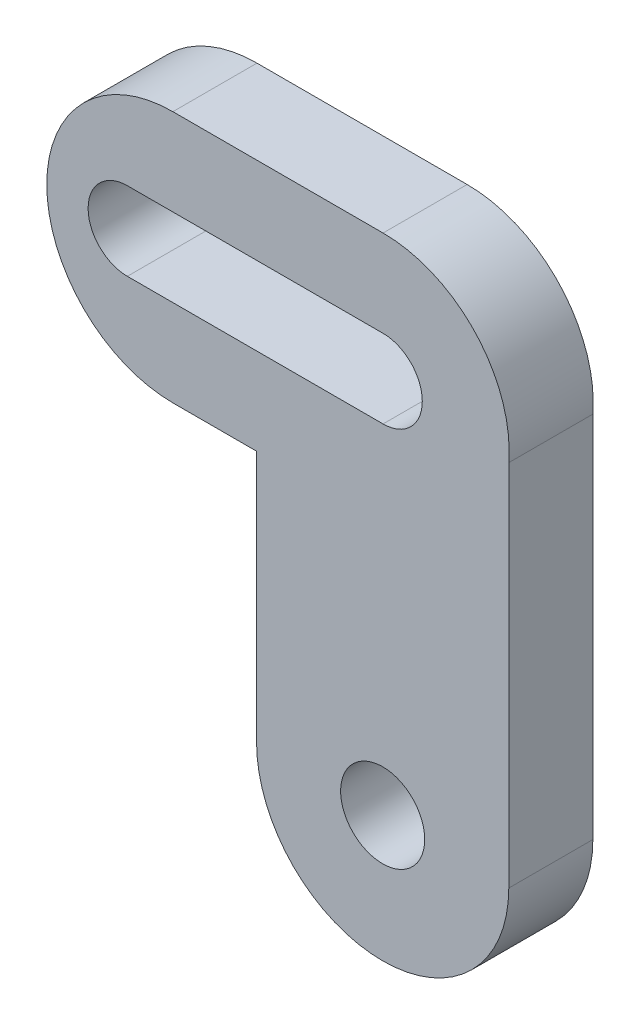
ISO-10303-21;
HEADER;
FILE_DESCRIPTION(('STEP AP214'),'2;1');
FILE_NAME('part.step','',(''),(''),'','','');
FILE_SCHEMA(('AUTOMOTIVE_DESIGN { 1 0 10303 214 1 1 1 1 }'));
ENDSEC;
DATA;
#1=APPLICATION_CONTEXT('core data for automotive mechanical design processes');
#2=APPLICATION_PROTOCOL_DEFINITION('international standard','automotive_design',2000,#1);
#3=PRODUCT_CONTEXT('',#1,'mechanical');
#4=PRODUCT('Part','Part','',(#3));
#5=PRODUCT_RELATED_PRODUCT_CATEGORY('part','',(#4));
#6=PRODUCT_DEFINITION_FORMATION('','',#4);
#7=PRODUCT_DEFINITION_CONTEXT('part definition',#1,'design');
#8=PRODUCT_DEFINITION('design','',#6,#7);
#9=PRODUCT_DEFINITION_SHAPE('','',#8);
#10=(LENGTH_UNIT() NAMED_UNIT(*) SI_UNIT(.MILLI.,.METRE.));
#11=(NAMED_UNIT(*) PLANE_ANGLE_UNIT() SI_UNIT($,.RADIAN.));
#12=(NAMED_UNIT(*) SI_UNIT($,.STERADIAN.) SOLID_ANGLE_UNIT());
#13=UNCERTAINTY_MEASURE_WITH_UNIT(LENGTH_MEASURE(1.E-05),#10,'distance_accuracy_value','');
#14=(GEOMETRIC_REPRESENTATION_CONTEXT(3) GLOBAL_UNCERTAINTY_ASSIGNED_CONTEXT((#13)) GLOBAL_UNIT_ASSIGNED_CONTEXT((#10,
#11,#12)) REPRESENTATION_CONTEXT('',''));
#15=CARTESIAN_POINT('',(0.,0.,0.));
#16=DIRECTION('',(0.,0.,1.));
#17=DIRECTION('',(1.,0.,0.));
#18=AXIS2_PLACEMENT_3D('',#15,#16,#17);
#19=CARTESIAN_POINT('',(180.8549532214,220.7512286528,3.));
#20=DIRECTION('',(0.,0.,-1.));
#21=DIRECTION('',(-1.,0.,0.));
#22=AXIS2_PLACEMENT_3D('',#19,#20,#21);
#23=CYLINDRICAL_SURFACE('',#22,1.40000000000001);
#24=CARTESIAN_POINT('',(180.8549532214,220.7512286528,0.));
#25=DIRECTION('',(0.,0.,1.));
#26=DIRECTION('',(1.,0.,0.));
#27=AXIS2_PLACEMENT_3D('',#24,#25,#26);
#28=CIRCLE('',#27,1.40000000000001);
#29=CARTESIAN_POINT('',(180.8549532214,219.3512286528,0.));
#30=VERTEX_POINT('',#29);
#31=CARTESIAN_POINT('',(180.8549532214,222.1512286528,0.));
#32=VERTEX_POINT('',#31);
#33=EDGE_CURVE('E172',#30,#32,#28,.T.);
#34=ORIENTED_EDGE('',*,*,#33,.F.);
#35=DIRECTION('',(0.,0.,-1.));
#36=VECTOR('',#35,1.);
#37=CARTESIAN_POINT('',(180.8549532214,219.3512286528,3.));
#38=LINE('',#37,#36);
#39=CARTESIAN_POINT('',(180.8549532214,219.3512286528,3.));
#40=VERTEX_POINT('',#39);
#41=EDGE_CURVE('E11',#40,#30,#38,.T.);
#42=ORIENTED_EDGE('',*,*,#41,.F.);
#43=CARTESIAN_POINT('',(180.8549532214,220.7512286528,3.));
#44=DIRECTION('',(0.,0.,1.));
#45=DIRECTION('',(1.,0.,0.));
#46=AXIS2_PLACEMENT_3D('',#43,#44,#45);
#47=CIRCLE('',#46,1.40000000000001);
#48=CARTESIAN_POINT('',(180.8549532214,222.1512286528,3.));
#49=VERTEX_POINT('',#48);
#50=EDGE_CURVE('E140',#40,#49,#47,.T.);
#51=ORIENTED_EDGE('',*,*,#50,.T.);
#52=DIRECTION('',(0.,0.,-1.));
#53=VECTOR('',#52,1.);
#54=CARTESIAN_POINT('',(180.8549532214,222.1512286528,3.));
#55=LINE('',#54,#53);
#56=EDGE_CURVE('E95',#49,#32,#55,.T.);
#57=ORIENTED_EDGE('',*,*,#56,.T.);
#58=EDGE_LOOP('',(#34,#42,#51,#57));
#59=FACE_BOUND('',#58,.T.);
#60=ADVANCED_FACE('F33',(#59),#23,.F.);
#61=CARTESIAN_POINT('',(0.,219.3512286528,3.));
#62=DIRECTION('',(0.,1.,0.));
#63=DIRECTION('',(0.,0.,1.));
#64=AXIS2_PLACEMENT_3D('',#61,#62,#63);
#65=PLANE('',#64);
#66=DIRECTION('',(1.,0.,0.));
#67=VECTOR('',#66,1.);
#68=CARTESIAN_POINT('',(0.,219.3512286528,0.));
#69=LINE('',#68,#67);
#70=CARTESIAN_POINT('',(171.7299532214,219.3512286528,0.));
#71=VERTEX_POINT('',#70);
#72=EDGE_CURVE('E131',#71,#30,#69,.T.);
#73=ORIENTED_EDGE('',*,*,#72,.F.);
#74=DIRECTION('',(0.,0.,-1.));
#75=VECTOR('',#74,1.);
#76=CARTESIAN_POINT('',(171.7299532214,219.3512286528,3.));
#77=LINE('',#76,#75);
#78=CARTESIAN_POINT('',(171.7299532214,219.3512286528,3.));
#79=VERTEX_POINT('',#78);
#80=EDGE_CURVE('E43',#79,#71,#77,.T.);
#81=ORIENTED_EDGE('',*,*,#80,.F.);
#82=DIRECTION('',(1.,0.,0.));
#83=VECTOR('',#82,1.);
#84=CARTESIAN_POINT('',(0.,219.3512286528,3.));
#85=LINE('',#84,#83);
#86=EDGE_CURVE('E129',#79,#40,#85,.T.);
#87=ORIENTED_EDGE('',*,*,#86,.T.);
#88=ORIENTED_EDGE('',*,*,#41,.T.);
#89=EDGE_LOOP('',(#73,#81,#87,#88));
#90=FACE_BOUND('',#89,.T.);
#91=ADVANCED_FACE('F128',(#90),#65,.T.);
#92=CARTESIAN_POINT('',(171.7299532214,220.7512286528,3.));
#93=DIRECTION('',(0.,0.,-1.));
#94=DIRECTION('',(-1.,0.,0.));
#95=AXIS2_PLACEMENT_3D('',#92,#93,#94);
#96=CYLINDRICAL_SURFACE('',#95,1.40000000000001);
#97=CARTESIAN_POINT('',(171.7299532214,220.7512286528,0.));
#98=DIRECTION('',(0.,0.,1.));
#99=DIRECTION('',(1.,0.,0.));
#100=AXIS2_PLACEMENT_3D('',#97,#98,#99);
#101=CIRCLE('',#100,1.40000000000001);
#102=CARTESIAN_POINT('',(171.7299532214,222.1512286528,0.));
#103=VERTEX_POINT('',#102);
#104=EDGE_CURVE('E176',#103,#71,#101,.T.);
#105=ORIENTED_EDGE('',*,*,#104,.F.);
#106=DIRECTION('',(0.,0.,-1.));
#107=VECTOR('',#106,1.);
#108=CARTESIAN_POINT('',(171.7299532214,222.1512286528,3.));
#109=LINE('',#108,#107);
#110=CARTESIAN_POINT('',(171.7299532214,222.1512286528,3.));
#111=VERTEX_POINT('',#110);
#112=EDGE_CURVE('E88',#111,#103,#109,.T.);
#113=ORIENTED_EDGE('',*,*,#112,.F.);
#114=CARTESIAN_POINT('',(171.7299532214,220.7512286528,3.));
#115=DIRECTION('',(0.,0.,1.));
#116=DIRECTION('',(1.,0.,0.));
#117=AXIS2_PLACEMENT_3D('',#114,#115,#116);
#118=CIRCLE('',#117,1.40000000000001);
#119=EDGE_CURVE('E139',#111,#79,#118,.T.);
#120=ORIENTED_EDGE('',*,*,#119,.T.);
#121=ORIENTED_EDGE('',*,*,#80,.T.);
#122=EDGE_LOOP('',(#105,#113,#120,#121));
#123=FACE_BOUND('',#122,.T.);
#124=ADVANCED_FACE('F142',(#123),#96,.F.);
#125=CARTESIAN_POINT('',(185.3409928876,0.,3.));
#126=DIRECTION('',(1.,0.,0.));
#127=DIRECTION('',(0.,0.,-1.));
#128=AXIS2_PLACEMENT_3D('',#125,#126,#127);
#129=PLANE('',#128);
#130=DIRECTION('',(0.,-1.,0.));
#131=VECTOR('',#130,1.);
#132=CARTESIAN_POINT('',(185.3409928876,0.,0.));
#133=LINE('',#132,#131);
#134=CARTESIAN_POINT('',(185.3409928876,220.397042101277,0.));
#135=VERTEX_POINT('',#134);
#136=CARTESIAN_POINT('',(185.3409928876,207.2512286528,0.));
#137=VERTEX_POINT('',#136);
#138=EDGE_CURVE('E151',#135,#137,#133,.T.);
#139=ORIENTED_EDGE('',*,*,#138,.F.);
#140=DIRECTION('',(0.,0.,-1.));
#141=VECTOR('',#140,1.);
#142=CARTESIAN_POINT('',(185.3409928876,220.397042101277,3.));
#143=LINE('',#142,#141);
#144=CARTESIAN_POINT('',(185.3409928876,220.397042101277,3.));
#145=VERTEX_POINT('',#144);
#146=EDGE_CURVE('E37',#145,#135,#143,.T.);
#147=ORIENTED_EDGE('',*,*,#146,.F.);
#148=DIRECTION('',(0.,-1.,0.));
#149=VECTOR('',#148,1.);
#150=CARTESIAN_POINT('',(185.3409928876,0.,3.));
#151=LINE('',#150,#149);
#152=CARTESIAN_POINT('',(185.3409928876,207.2512286528,3.));
#153=VERTEX_POINT('',#152);
#154=EDGE_CURVE('E183',#145,#153,#151,.T.);
#155=ORIENTED_EDGE('',*,*,#154,.T.);
#156=DIRECTION('',(0.,0.,-1.));
#157=VECTOR('',#156,1.);
#158=CARTESIAN_POINT('',(185.3409928876,207.2512286528,3.));
#159=LINE('',#158,#157);
#160=EDGE_CURVE('E150',#153,#137,#159,.T.);
#161=ORIENTED_EDGE('',*,*,#160,.T.);
#162=EDGE_LOOP('',(#139,#147,#155,#161));
#163=FACE_BOUND('',#162,.T.);
#164=ADVANCED_FACE('F35',(#163),#129,.T.);
#165=CARTESIAN_POINT('',(180.8549532214,220.7512286528,3.));
#166=DIRECTION('',(0.,0.,-1.));
#167=DIRECTION('',(-1.,0.,0.));
#168=AXIS2_PLACEMENT_3D('',#165,#166,#167);
#169=CYLINDRICAL_SURFACE('',#168,4.5);
#170=CARTESIAN_POINT('',(180.8549532214,220.7512286528,0.));
#171=DIRECTION('',(0.,0.,1.));
#172=DIRECTION('',(1.,0.,0.));
#173=AXIS2_PLACEMENT_3D('',#170,#171,#172);
#174=CIRCLE('',#173,4.5);
#175=CARTESIAN_POINT('',(180.8549532214,225.2512286528,0.));
#176=VERTEX_POINT('',#175);
#177=EDGE_CURVE('E154',#135,#176,#174,.T.);
#178=ORIENTED_EDGE('',*,*,#177,.T.);
#179=DIRECTION('',(0.,0.,-1.));
#180=VECTOR('',#179,1.);
#181=CARTESIAN_POINT('',(180.8549532214,225.2512286528,3.));
#182=LINE('',#181,#180);
#183=CARTESIAN_POINT('',(180.8549532214,225.2512286528,3.));
#184=VERTEX_POINT('',#183);
#185=EDGE_CURVE('E194',#184,#176,#182,.T.);
#186=ORIENTED_EDGE('',*,*,#185,.F.);
#187=CARTESIAN_POINT('',(180.8549532214,220.7512286528,3.));
#188=DIRECTION('',(0.,0.,1.));
#189=DIRECTION('',(1.,0.,0.));
#190=AXIS2_PLACEMENT_3D('',#187,#188,#189);
#191=CIRCLE('',#190,4.5);
#192=EDGE_CURVE('E202',#145,#184,#191,.T.);
#193=ORIENTED_EDGE('',*,*,#192,.F.);
#194=ORIENTED_EDGE('',*,*,#146,.T.);
#195=EDGE_LOOP('',(#178,#186,#193,#194));
#196=FACE_BOUND('',#195,.T.);
#197=ADVANCED_FACE('F201',(#196),#169,.T.);
#198=CARTESIAN_POINT('',(0.,225.2512286528,3.));
#199=DIRECTION('',(0.,1.,0.));
#200=DIRECTION('',(0.,0.,1.));
#201=AXIS2_PLACEMENT_3D('',#198,#199,#200);
#202=PLANE('',#201);
#203=DIRECTION('',(1.,0.,0.));
#204=VECTOR('',#203,1.);
#205=CARTESIAN_POINT('',(0.,225.2512286528,0.));
#206=LINE('',#205,#204);
#207=CARTESIAN_POINT('',(173.3549532214,225.2512286528,0.));
#208=VERTEX_POINT('',#207);
#209=EDGE_CURVE('E157',#208,#176,#206,.T.);
#210=ORIENTED_EDGE('',*,*,#209,.F.);
#211=DIRECTION('',(0.,0.,-1.));
#212=VECTOR('',#211,1.);
#213=CARTESIAN_POINT('',(173.3549532214,225.2512286528,3.));
#214=LINE('',#213,#212);
#215=CARTESIAN_POINT('',(173.3549532214,225.2512286528,3.));
#216=VERTEX_POINT('',#215);
#217=EDGE_CURVE('E193',#216,#208,#214,.T.);
#218=ORIENTED_EDGE('',*,*,#217,.F.);
#219=DIRECTION('',(1.,0.,0.));
#220=VECTOR('',#219,1.);
#221=CARTESIAN_POINT('',(0.,225.2512286528,3.));
#222=LINE('',#221,#220);
#223=EDGE_CURVE('E229',#216,#184,#222,.T.);
#224=ORIENTED_EDGE('',*,*,#223,.T.);
#225=ORIENTED_EDGE('',*,*,#185,.T.);
#226=EDGE_LOOP('',(#210,#218,#224,#225));
#227=FACE_BOUND('',#226,.T.);
#228=ADVANCED_FACE('F226',(#227),#202,.T.);
#229=CARTESIAN_POINT('',(173.3549532214,220.7512286528,3.));
#230=DIRECTION('',(0.,0.,-1.));
#231=DIRECTION('',(-1.,0.,0.));
#232=AXIS2_PLACEMENT_3D('',#229,#230,#231);
#233=CYLINDRICAL_SURFACE('',#232,4.5);
#234=CARTESIAN_POINT('',(173.3549532214,220.7512286528,0.));
#235=DIRECTION('',(0.,0.,1.));
#236=DIRECTION('',(1.,0.,0.));
#237=AXIS2_PLACEMENT_3D('',#234,#235,#236);
#238=CIRCLE('',#237,4.5);
#239=CARTESIAN_POINT('',(173.3549532214,216.2512286528,0.));
#240=VERTEX_POINT('',#239);
#241=EDGE_CURVE('E160',#208,#240,#238,.T.);
#242=ORIENTED_EDGE('',*,*,#241,.T.);
#243=DIRECTION('',(0.,0.,-1.));
#244=VECTOR('',#243,1.);
#245=CARTESIAN_POINT('',(173.3549532214,216.2512286528,3.));
#246=LINE('',#245,#244);
#247=CARTESIAN_POINT('',(173.3549532214,216.2512286528,3.));
#248=VERTEX_POINT('',#247);
#249=EDGE_CURVE('E191',#248,#240,#246,.T.);
#250=ORIENTED_EDGE('',*,*,#249,.F.);
#251=CARTESIAN_POINT('',(173.3549532214,220.7512286528,3.));
#252=DIRECTION('',(0.,0.,1.));
#253=DIRECTION('',(1.,0.,0.));
#254=AXIS2_PLACEMENT_3D('',#251,#252,#253);
#255=CIRCLE('',#254,4.5);
#256=EDGE_CURVE('E230',#216,#248,#255,.T.);
#257=ORIENTED_EDGE('',*,*,#256,.F.);
#258=ORIENTED_EDGE('',*,*,#217,.T.);
#259=EDGE_LOOP('',(#242,#250,#257,#258));
#260=FACE_BOUND('',#259,.T.);
#261=ADVANCED_FACE('F231',(#260),#233,.T.);
#262=CARTESIAN_POINT('',(0.,216.2512286528,3.));
#263=DIRECTION('',(0.,-1.,0.));
#264=DIRECTION('',(0.,0.,-1.));
#265=AXIS2_PLACEMENT_3D('',#262,#263,#264);
#266=PLANE('',#265);
#267=DIRECTION('',(-1.,0.,0.));
#268=VECTOR('',#267,1.);
#269=CARTESIAN_POINT('',(0.,216.2512286528,0.));
#270=LINE('',#269,#268);
#271=CARTESIAN_POINT('',(176.3409928876,216.2512286528,0.));
#272=VERTEX_POINT('',#271);
#273=EDGE_CURVE('E163',#272,#240,#270,.T.);
#274=ORIENTED_EDGE('',*,*,#273,.F.);
#275=DIRECTION('',(0.,0.,-1.));
#276=VECTOR('',#275,1.);
#277=CARTESIAN_POINT('',(176.3409928876,216.2512286528,3.));
#278=LINE('',#277,#276);
#279=CARTESIAN_POINT('',(176.3409928876,216.2512286528,3.));
#280=VERTEX_POINT('',#279);
#281=EDGE_CURVE('E189',#280,#272,#278,.T.);
#282=ORIENTED_EDGE('',*,*,#281,.F.);
#283=DIRECTION('',(-1.,0.,0.));
#284=VECTOR('',#283,1.);
#285=CARTESIAN_POINT('',(0.,216.2512286528,3.));
#286=LINE('',#285,#284);
#287=EDGE_CURVE('E233',#280,#248,#286,.T.);
#288=ORIENTED_EDGE('',*,*,#287,.T.);
#289=ORIENTED_EDGE('',*,*,#249,.T.);
#290=EDGE_LOOP('',(#274,#282,#288,#289));
#291=FACE_BOUND('',#290,.T.);
#292=ADVANCED_FACE('F223',(#291),#266,.T.);
#293=CARTESIAN_POINT('',(176.3409928876,0.,3.));
#294=DIRECTION('',(-1.,0.,0.));
#295=DIRECTION('',(0.,0.,1.));
#296=AXIS2_PLACEMENT_3D('',#293,#294,#295);
#297=PLANE('',#296);
#298=DIRECTION('',(0.,1.,0.));
#299=VECTOR('',#298,1.);
#300=CARTESIAN_POINT('',(176.3409928876,0.,0.));
#301=LINE('',#300,#299);
#302=CARTESIAN_POINT('',(176.3409928876,207.2512286528,0.));
#303=VERTEX_POINT('',#302);
#304=EDGE_CURVE('E166',#303,#272,#301,.T.);
#305=ORIENTED_EDGE('',*,*,#304,.F.);
#306=DIRECTION('',(0.,0.,-1.));
#307=VECTOR('',#306,1.);
#308=CARTESIAN_POINT('',(176.3409928876,207.2512286528,3.));
#309=LINE('',#308,#307);
#310=CARTESIAN_POINT('',(176.3409928876,207.2512286528,3.));
#311=VERTEX_POINT('',#310);
#312=EDGE_CURVE('E187',#311,#303,#309,.T.);
#313=ORIENTED_EDGE('',*,*,#312,.F.);
#314=DIRECTION('',(0.,1.,0.));
#315=VECTOR('',#314,1.);
#316=CARTESIAN_POINT('',(176.3409928876,0.,3.));
#317=LINE('',#316,#315);
#318=EDGE_CURVE('E219',#311,#280,#317,.T.);
#319=ORIENTED_EDGE('',*,*,#318,.T.);
#320=ORIENTED_EDGE('',*,*,#281,.T.);
#321=EDGE_LOOP('',(#305,#313,#319,#320));
#322=FACE_BOUND('',#321,.T.);
#323=ADVANCED_FACE('F215',(#322),#297,.T.);
#324=CARTESIAN_POINT('',(0.,222.1512286528,3.));
#325=DIRECTION('',(0.,1.,0.));
#326=DIRECTION('',(0.,0.,1.));
#327=AXIS2_PLACEMENT_3D('',#324,#325,#326);
#328=PLANE('',#327);
#329=DIRECTION('',(1.,0.,0.));
#330=VECTOR('',#329,1.);
#331=CARTESIAN_POINT('',(0.,222.1512286528,0.));
#332=LINE('',#331,#330);
#333=EDGE_CURVE('E178',#103,#32,#332,.T.);
#334=ORIENTED_EDGE('',*,*,#333,.T.);
#335=ORIENTED_EDGE('',*,*,#56,.F.);
#336=DIRECTION('',(1.,0.,0.));
#337=VECTOR('',#336,1.);
#338=CARTESIAN_POINT('',(0.,222.1512286528,3.));
#339=LINE('',#338,#337);
#340=EDGE_CURVE('E52',#111,#49,#339,.T.);
#341=ORIENTED_EDGE('',*,*,#340,.F.);
#342=ORIENTED_EDGE('',*,*,#112,.T.);
#343=EDGE_LOOP('',(#334,#335,#341,#342));
#344=FACE_BOUND('',#343,.T.);
#345=ADVANCED_FACE('F243',(#344),#328,.F.);
#346=CARTESIAN_POINT('',(180.8409928876,207.2512286528,3.));
#347=DIRECTION('',(0.,0.,-1.));
#348=DIRECTION('',(-1.,0.,0.));
#349=AXIS2_PLACEMENT_3D('',#346,#347,#348);
#350=CYLINDRICAL_SURFACE('',#349,4.49999999999999);
#351=CARTESIAN_POINT('',(180.8409928876,207.2512286528,0.));
#352=DIRECTION('',(0.,0.,1.));
#353=DIRECTION('',(1.,0.,0.));
#354=AXIS2_PLACEMENT_3D('',#351,#352,#353);
#355=CIRCLE('',#354,4.49999999999999);
#356=EDGE_CURVE('E169',#303,#137,#355,.T.);
#357=ORIENTED_EDGE('',*,*,#356,.T.);
#358=ORIENTED_EDGE('',*,*,#160,.F.);
#359=CARTESIAN_POINT('',(180.8409928876,207.2512286528,3.));
#360=DIRECTION('',(0.,0.,1.));
#361=DIRECTION('',(1.,0.,0.));
#362=AXIS2_PLACEMENT_3D('',#359,#360,#361);
#363=CIRCLE('',#362,4.49999999999999);
#364=EDGE_CURVE('E241',#311,#153,#363,.T.);
#365=ORIENTED_EDGE('',*,*,#364,.F.);
#366=ORIENTED_EDGE('',*,*,#312,.T.);
#367=EDGE_LOOP('',(#357,#358,#365,#366));
#368=FACE_BOUND('',#367,.T.);
#369=ADVANCED_FACE('F212',(#368),#350,.T.);
#370=CARTESIAN_POINT('',(180.8409928876,207.2512286528,3.));
#371=DIRECTION('',(0.,0.,-1.));
#372=DIRECTION('',(-1.,0.,0.));
#373=AXIS2_PLACEMENT_3D('',#370,#371,#372);
#374=CYLINDRICAL_SURFACE('',#373,1.5);
#375=CARTESIAN_POINT('',(180.8409928876,207.2512286528,3.));
#376=DIRECTION('',(0.,0.,1.));
#377=DIRECTION('',(1.,0.,0.));
#378=AXIS2_PLACEMENT_3D('',#375,#376,#377);
#379=CIRCLE('',#378,1.5);
#380=CARTESIAN_POINT('',(182.3409928876,207.2512286528,3.));
#381=VERTEX_POINT('',#380);
#382=EDGE_CURVE('E144',#381,#381,#379,.T.);
#383=ORIENTED_EDGE('',*,*,#382,.T.);
#384=EDGE_LOOP('',(#383));
#385=FACE_BOUND('',#384,.T.);
#386=CARTESIAN_POINT('',(180.8409928876,207.2512286528,0.));
#387=DIRECTION('',(0.,0.,1.));
#388=DIRECTION('',(1.,0.,0.));
#389=AXIS2_PLACEMENT_3D('',#386,#387,#388);
#390=CIRCLE('',#389,1.5);
#391=CARTESIAN_POINT('',(182.3409928876,207.2512286528,0.));
#392=VERTEX_POINT('',#391);
#393=EDGE_CURVE('E180',#392,#392,#390,.T.);
#394=ORIENTED_EDGE('',*,*,#393,.F.);
#395=EDGE_LOOP('',(#394));
#396=FACE_BOUND('',#395,.T.);
#397=ADVANCED_FACE('F250',(#385,#396),#374,.F.);
#398=CARTESIAN_POINT('',(0.,0.,3.));
#399=DIRECTION('',(0.,0.,1.));
#400=DIRECTION('',(1.,0.,0.));
#401=AXIS2_PLACEMENT_3D('',#398,#399,#400);
#402=PLANE('',#401);
#403=ORIENTED_EDGE('',*,*,#154,.F.);
#404=ORIENTED_EDGE('',*,*,#192,.T.);
#405=ORIENTED_EDGE('',*,*,#223,.F.);
#406=ORIENTED_EDGE('',*,*,#256,.T.);
#407=ORIENTED_EDGE('',*,*,#287,.F.);
#408=ORIENTED_EDGE('',*,*,#318,.F.);
#409=ORIENTED_EDGE('',*,*,#364,.T.);
#410=EDGE_LOOP('',(#403,#404,#405,#406,#407,#408,#409));
#411=FACE_BOUND('',#410,.T.);
#412=ORIENTED_EDGE('',*,*,#50,.F.);
#413=ORIENTED_EDGE('',*,*,#86,.F.);
#414=ORIENTED_EDGE('',*,*,#119,.F.);
#415=ORIENTED_EDGE('',*,*,#340,.T.);
#416=EDGE_LOOP('',(#412,#413,#414,#415));
#417=FACE_BOUND('',#416,.T.);
#418=ORIENTED_EDGE('',*,*,#382,.F.);
#419=EDGE_LOOP('',(#418));
#420=FACE_BOUND('',#419,.T.);
#421=ADVANCED_FACE('F137',(#411,#417,#420),#402,.T.);
#422=CARTESIAN_POINT('',(0.,0.,0.));
#423=DIRECTION('',(0.,0.,1.));
#424=DIRECTION('',(1.,0.,0.));
#425=AXIS2_PLACEMENT_3D('',#422,#423,#424);
#426=PLANE('',#425);
#427=ORIENTED_EDGE('',*,*,#138,.T.);
#428=ORIENTED_EDGE('',*,*,#356,.F.);
#429=ORIENTED_EDGE('',*,*,#304,.T.);
#430=ORIENTED_EDGE('',*,*,#273,.T.);
#431=ORIENTED_EDGE('',*,*,#241,.F.);
#432=ORIENTED_EDGE('',*,*,#209,.T.);
#433=ORIENTED_EDGE('',*,*,#177,.F.);
#434=EDGE_LOOP('',(#427,#428,#429,#430,#431,#432,#433));
#435=FACE_BOUND('',#434,.T.);
#436=ORIENTED_EDGE('',*,*,#33,.T.);
#437=ORIENTED_EDGE('',*,*,#333,.F.);
#438=ORIENTED_EDGE('',*,*,#104,.T.);
#439=ORIENTED_EDGE('',*,*,#72,.T.);
#440=EDGE_LOOP('',(#436,#437,#438,#439));
#441=FACE_BOUND('',#440,.T.);
#442=ORIENTED_EDGE('',*,*,#393,.T.);
#443=EDGE_LOOP('',(#442));
#444=FACE_BOUND('',#443,.T.);
#445=ADVANCED_FACE('F205',(#435,#441,#444),#426,.F.);
#446=CLOSED_SHELL('',(#60,#91,#124,#164,#197,#228,#261,#292,#323,#345,#369,#397,#421,#445));
#447=MANIFOLD_SOLID_BREP('B2',#446);
#448=ADVANCED_BREP_SHAPE_REPRESENTATION('',(#18,#447),#14);
#449=SHAPE_DEFINITION_REPRESENTATION(#9,#448);
ENDSEC;
END-ISO-10303-21;
